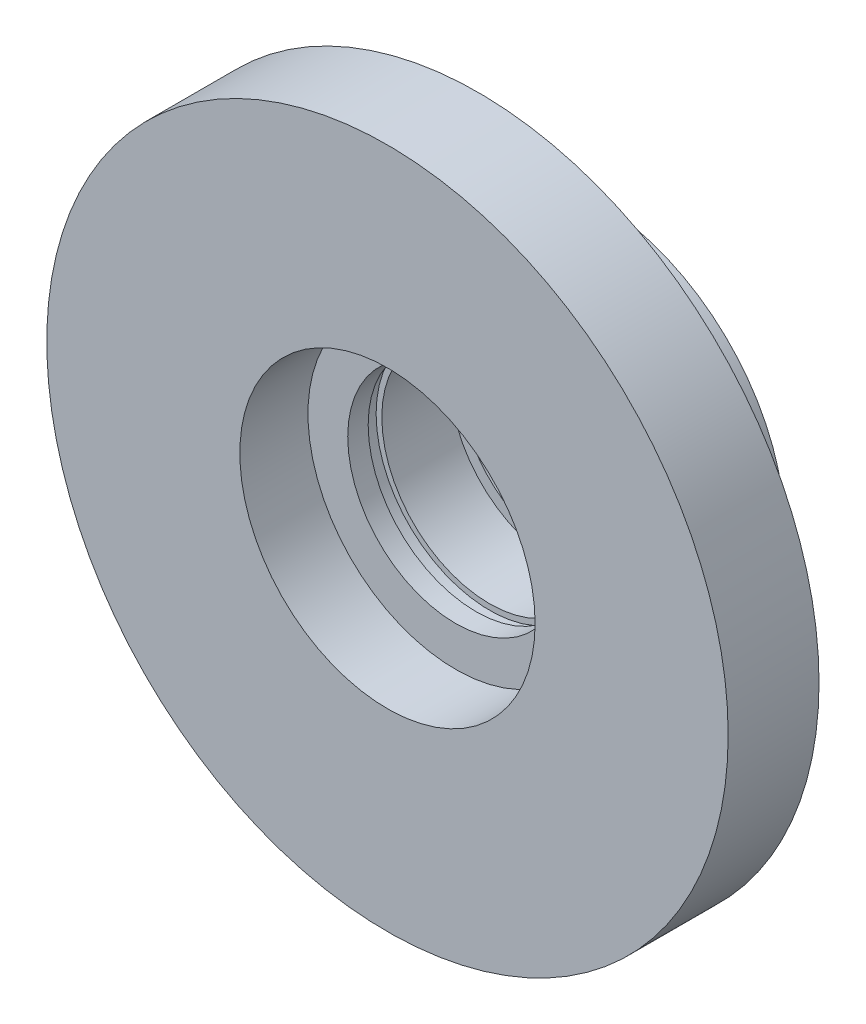
ISO-10303-21;
HEADER;
FILE_DESCRIPTION(('STEP AP214'),'2;1');
FILE_NAME('part.step','',(''),(''),'','','');
FILE_SCHEMA(('AUTOMOTIVE_DESIGN { 1 0 10303 214 1 1 1 1 }'));
ENDSEC;
DATA;
#1=APPLICATION_CONTEXT('core data for automotive mechanical design processes');
#2=APPLICATION_PROTOCOL_DEFINITION('international standard','automotive_design',2000,#1);
#3=PRODUCT_CONTEXT('',#1,'mechanical');
#4=PRODUCT('Part','Part','',(#3));
#5=PRODUCT_RELATED_PRODUCT_CATEGORY('part','',(#4));
#6=PRODUCT_DEFINITION_FORMATION('','',#4);
#7=PRODUCT_DEFINITION_CONTEXT('part definition',#1,'design');
#8=PRODUCT_DEFINITION('design','',#6,#7);
#9=PRODUCT_DEFINITION_SHAPE('','',#8);
#10=(LENGTH_UNIT() NAMED_UNIT(*) SI_UNIT(.MILLI.,.METRE.));
#11=(NAMED_UNIT(*) PLANE_ANGLE_UNIT() SI_UNIT($,.RADIAN.));
#12=(NAMED_UNIT(*) SI_UNIT($,.STERADIAN.) SOLID_ANGLE_UNIT());
#13=UNCERTAINTY_MEASURE_WITH_UNIT(LENGTH_MEASURE(1.E-05),#10,'distance_accuracy_value','');
#14=(GEOMETRIC_REPRESENTATION_CONTEXT(3) GLOBAL_UNCERTAINTY_ASSIGNED_CONTEXT((#13)) GLOBAL_UNIT_ASSIGNED_CONTEXT((#10,
#11,#12)) REPRESENTATION_CONTEXT('',''));
#15=CARTESIAN_POINT('',(0.,0.,0.));
#16=DIRECTION('',(0.,0.,1.));
#17=DIRECTION('',(1.,0.,0.));
#18=AXIS2_PLACEMENT_3D('',#15,#16,#17);
#19=CARTESIAN_POINT('',(0.,0.,12.));
#20=DIRECTION('',(0.,0.,-1.));
#21=DIRECTION('',(-1.,0.,0.));
#22=AXIS2_PLACEMENT_3D('',#19,#20,#21);
#23=CYLINDRICAL_SURFACE('',#22,9.5);
#24=CARTESIAN_POINT('',(0.,0.,3.));
#25=DIRECTION('',(0.,0.,1.));
#26=DIRECTION('',(1.,0.,0.));
#27=AXIS2_PLACEMENT_3D('',#24,#25,#26);
#28=CIRCLE('',#27,9.5);
#29=CARTESIAN_POINT('',(9.5,0.,3.));
#30=VERTEX_POINT('',#29);
#31=EDGE_CURVE('E53',#30,#30,#28,.T.);
#32=ORIENTED_EDGE('',*,*,#31,.F.);
#33=EDGE_LOOP('',(#32));
#34=FACE_BOUND('',#33,.T.);
#35=CARTESIAN_POINT('',(0.,0.,9.));
#36=DIRECTION('',(0.,0.,1.));
#37=DIRECTION('',(1.,0.,0.));
#38=AXIS2_PLACEMENT_3D('',#35,#36,#37);
#39=CIRCLE('',#38,9.5);
#40=CARTESIAN_POINT('',(9.5,0.,9.));
#41=VERTEX_POINT('',#40);
#42=EDGE_CURVE('E35',#41,#41,#39,.T.);
#43=ORIENTED_EDGE('',*,*,#42,.T.);
#44=EDGE_LOOP('',(#43));
#45=FACE_BOUND('',#44,.T.);
#46=ADVANCED_FACE('F31',(#34,#45),#23,.F.);
#47=CARTESIAN_POINT('',(0.,0.,3.));
#48=DIRECTION('',(0.,0.,-1.));
#49=DIRECTION('',(-1.,0.,0.));
#50=AXIS2_PLACEMENT_3D('',#47,#48,#49);
#51=PLANE('',#50);
#52=CARTESIAN_POINT('',(0.,0.,3.));
#53=DIRECTION('',(0.,0.,-1.));
#54=DIRECTION('',(-1.,0.,0.));
#55=AXIS2_PLACEMENT_3D('',#52,#53,#54);
#56=CIRCLE('',#55,8.5);
#57=CARTESIAN_POINT('',(-8.5,0.,3.));
#58=VERTEX_POINT('',#57);
#59=EDGE_CURVE('E68',#58,#58,#56,.T.);
#60=ORIENTED_EDGE('',*,*,#59,.T.);
#61=EDGE_LOOP('',(#60));
#62=FACE_BOUND('',#61,.T.);
#63=ORIENTED_EDGE('',*,*,#31,.T.);
#64=EDGE_LOOP('',(#63));
#65=FACE_BOUND('',#64,.T.);
#66=ADVANCED_FACE('F100',(#62,#65),#51,.F.);
#67=CARTESIAN_POINT('',(0.,0.,10.));
#68=DIRECTION('',(0.,0.,-1.));
#69=DIRECTION('',(-1.,0.,0.));
#70=AXIS2_PLACEMENT_3D('',#67,#68,#69);
#71=CYLINDRICAL_SURFACE('',#70,13.);
#72=CARTESIAN_POINT('',(0.,0.,12.));
#73=DIRECTION('',(0.,0.,1.));
#74=DIRECTION('',(1.,0.,0.));
#75=AXIS2_PLACEMENT_3D('',#72,#73,#74);
#76=CIRCLE('',#75,13.);
#77=CARTESIAN_POINT('',(13.,0.,12.));
#78=VERTEX_POINT('',#77);
#79=EDGE_CURVE('E10',#78,#78,#76,.T.);
#80=ORIENTED_EDGE('',*,*,#79,.F.);
#81=EDGE_LOOP('',(#80));
#82=FACE_BOUND('',#81,.T.);
#83=CARTESIAN_POINT('',(0.,0.,18.));
#84=DIRECTION('',(0.,0.,1.));
#85=DIRECTION('',(1.,0.,0.));
#86=AXIS2_PLACEMENT_3D('',#83,#84,#85);
#87=CIRCLE('',#86,13.);
#88=CARTESIAN_POINT('',(13.,0.,18.));
#89=VERTEX_POINT('',#88);
#90=EDGE_CURVE('E71',#89,#89,#87,.T.);
#91=ORIENTED_EDGE('',*,*,#90,.T.);
#92=EDGE_LOOP('',(#91));
#93=FACE_BOUND('',#92,.T.);
#94=ADVANCED_FACE('F107',(#82,#93),#71,.F.);
#95=CARTESIAN_POINT('',(0.,0.,0.));
#96=DIRECTION('',(0.,0.,1.));
#97=DIRECTION('',(1.,0.,0.));
#98=AXIS2_PLACEMENT_3D('',#95,#96,#97);
#99=PLANE('',#98);
#100=CARTESIAN_POINT('',(0.,0.,0.));
#101=DIRECTION('',(0.,0.,1.));
#102=DIRECTION('',(1.,0.,0.));
#103=AXIS2_PLACEMENT_3D('',#100,#101,#102);
#104=CIRCLE('',#103,17.);
#105=CARTESIAN_POINT('',(17.,0.,0.));
#106=VERTEX_POINT('',#105);
#107=EDGE_CURVE('E44',#106,#106,#104,.T.);
#108=ORIENTED_EDGE('',*,*,#107,.F.);
#109=EDGE_LOOP('',(#108));
#110=FACE_BOUND('',#109,.T.);
#111=CARTESIAN_POINT('',(0.,0.,0.));
#112=DIRECTION('',(0.,0.,-1.));
#113=DIRECTION('',(-1.,0.,0.));
#114=AXIS2_PLACEMENT_3D('',#111,#112,#113);
#115=CIRCLE('',#114,8.5);
#116=CARTESIAN_POINT('',(-8.5,0.,0.));
#117=VERTEX_POINT('',#116);
#118=EDGE_CURVE('E65',#117,#117,#115,.T.);
#119=ORIENTED_EDGE('',*,*,#118,.F.);
#120=EDGE_LOOP('',(#119));
#121=FACE_BOUND('',#120,.T.);
#122=ADVANCED_FACE('F138',(#110,#121),#99,.F.);
#123=CARTESIAN_POINT('',(0.,0.,10.));
#124=DIRECTION('',(0.,0.,-1.));
#125=DIRECTION('',(-1.,0.,0.));
#126=AXIS2_PLACEMENT_3D('',#123,#124,#125);
#127=CYLINDRICAL_SURFACE('',#126,17.);
#128=ORIENTED_EDGE('',*,*,#107,.T.);
#129=EDGE_LOOP('',(#128));
#130=FACE_BOUND('',#129,.T.);
#131=CARTESIAN_POINT('',(0.,0.,10.));
#132=DIRECTION('',(0.,0.,1.));
#133=DIRECTION('',(1.,0.,0.));
#134=AXIS2_PLACEMENT_3D('',#131,#132,#133);
#135=CIRCLE('',#134,17.);
#136=CARTESIAN_POINT('',(17.,0.,10.));
#137=VERTEX_POINT('',#136);
#138=EDGE_CURVE('E39',#137,#137,#135,.T.);
#139=ORIENTED_EDGE('',*,*,#138,.F.);
#140=EDGE_LOOP('',(#139));
#141=FACE_BOUND('',#140,.T.);
#142=ADVANCED_FACE('F33',(#130,#141),#127,.T.);
#143=CARTESIAN_POINT('',(0.,0.,18.));
#144=DIRECTION('',(0.,0.,1.));
#145=DIRECTION('',(1.,0.,0.));
#146=AXIS2_PLACEMENT_3D('',#143,#144,#145);
#147=PLANE('',#146);
#148=CARTESIAN_POINT('',(0.,0.,18.));
#149=DIRECTION('',(0.,0.,1.));
#150=DIRECTION('',(1.,0.,0.));
#151=AXIS2_PLACEMENT_3D('',#148,#149,#150);
#152=CIRCLE('',#151,30.);
#153=CARTESIAN_POINT('',(30.,0.,18.));
#154=VERTEX_POINT('',#153);
#155=EDGE_CURVE('E77',#154,#154,#152,.T.);
#156=ORIENTED_EDGE('',*,*,#155,.T.);
#157=EDGE_LOOP('',(#156));
#158=FACE_BOUND('',#157,.T.);
#159=ORIENTED_EDGE('',*,*,#90,.F.);
#160=EDGE_LOOP('',(#159));
#161=FACE_BOUND('',#160,.T.);
#162=ADVANCED_FACE('F87',(#158,#161),#147,.T.);
#163=CARTESIAN_POINT('',(0.,0.,10.));
#164=DIRECTION('',(0.,0.,1.));
#165=DIRECTION('',(1.,0.,0.));
#166=AXIS2_PLACEMENT_3D('',#163,#164,#165);
#167=PLANE('',#166);
#168=ORIENTED_EDGE('',*,*,#138,.T.);
#169=EDGE_LOOP('',(#168));
#170=FACE_BOUND('',#169,.T.);
#171=CARTESIAN_POINT('',(0.,0.,10.));
#172=DIRECTION('',(0.,0.,1.));
#173=DIRECTION('',(1.,0.,0.));
#174=AXIS2_PLACEMENT_3D('',#171,#172,#173);
#175=CIRCLE('',#174,30.);
#176=CARTESIAN_POINT('',(30.,0.,10.));
#177=VERTEX_POINT('',#176);
#178=EDGE_CURVE('E76',#177,#177,#175,.T.);
#179=ORIENTED_EDGE('',*,*,#178,.F.);
#180=EDGE_LOOP('',(#179));
#181=FACE_BOUND('',#180,.T.);
#182=ADVANCED_FACE('F85',(#170,#181),#167,.F.);
#183=CARTESIAN_POINT('',(0.,0.,18.));
#184=DIRECTION('',(0.,0.,-1.));
#185=DIRECTION('',(-1.,0.,0.));
#186=AXIS2_PLACEMENT_3D('',#183,#184,#185);
#187=CYLINDRICAL_SURFACE('',#186,30.);
#188=ORIENTED_EDGE('',*,*,#155,.F.);
#189=EDGE_LOOP('',(#188));
#190=FACE_BOUND('',#189,.T.);
#191=ORIENTED_EDGE('',*,*,#178,.T.);
#192=EDGE_LOOP('',(#191));
#193=FACE_BOUND('',#192,.T.);
#194=ADVANCED_FACE('F83',(#190,#193),#187,.T.);
#195=CARTESIAN_POINT('',(0.,0.,3.));
#196=DIRECTION('',(0.,0.,-1.));
#197=DIRECTION('',(-1.,0.,0.));
#198=AXIS2_PLACEMENT_3D('',#195,#196,#197);
#199=CYLINDRICAL_SURFACE('',#198,8.5);
#200=ORIENTED_EDGE('',*,*,#59,.F.);
#201=EDGE_LOOP('',(#200));
#202=FACE_BOUND('',#201,.T.);
#203=ORIENTED_EDGE('',*,*,#118,.T.);
#204=EDGE_LOOP('',(#203));
#205=FACE_BOUND('',#204,.T.);
#206=ADVANCED_FACE('F94',(#202,#205),#199,.F.);
#207=CARTESIAN_POINT('',(0.,0.,12.));
#208=DIRECTION('',(0.,0.,1.));
#209=DIRECTION('',(1.,0.,0.));
#210=AXIS2_PLACEMENT_3D('',#207,#208,#209);
#211=PLANE('',#210);
#212=ORIENTED_EDGE('',*,*,#79,.T.);
#213=EDGE_LOOP('',(#212));
#214=FACE_BOUND('',#213,.T.);
#215=CARTESIAN_POINT('',(0.,0.,12.));
#216=DIRECTION('',(0.,0.,1.));
#217=DIRECTION('',(1.,0.,0.));
#218=AXIS2_PLACEMENT_3D('',#215,#216,#217);
#219=CIRCLE('',#218,9.5);
#220=CARTESIAN_POINT('',(9.5,0.,12.));
#221=VERTEX_POINT('',#220);
#222=EDGE_CURVE('E62',#221,#221,#219,.T.);
#223=ORIENTED_EDGE('',*,*,#222,.F.);
#224=EDGE_LOOP('',(#223));
#225=FACE_BOUND('',#224,.T.);
#226=ADVANCED_FACE('F116',(#214,#225),#211,.T.);
#227=CARTESIAN_POINT('',(0.,0.,10.2));
#228=DIRECTION('',(0.,0.,1.));
#229=DIRECTION('',(1.,0.,0.));
#230=AXIS2_PLACEMENT_3D('',#227,#228,#229);
#231=CIRCLE('',#230,9.5);
#232=CARTESIAN_POINT('',(9.5,0.,10.2));
#233=VERTEX_POINT('',#232);
#234=EDGE_CURVE('E47',#233,#233,#231,.T.);
#235=ORIENTED_EDGE('',*,*,#234,.F.);
#236=EDGE_LOOP('',(#235));
#237=FACE_BOUND('',#236,.T.);
#238=ORIENTED_EDGE('',*,*,#222,.T.);
#239=EDGE_LOOP('',(#238));
#240=FACE_BOUND('',#239,.T.);
#241=ADVANCED_FACE('F103',(#237,#240),#23,.F.);
#242=CARTESIAN_POINT('',(0.,0.,9.));
#243=DIRECTION('',(0.,0.,1.));
#244=DIRECTION('',(1.,0.,0.));
#245=AXIS2_PLACEMENT_3D('',#242,#243,#244);
#246=CYLINDRICAL_SURFACE('',#245,10.);
#247=CARTESIAN_POINT('',(0.,0.,9.));
#248=DIRECTION('',(0.,0.,1.));
#249=DIRECTION('',(1.,0.,0.));
#250=AXIS2_PLACEMENT_3D('',#247,#248,#249);
#251=CIRCLE('',#250,10.);
#252=CARTESIAN_POINT('',(10.,0.,9.));
#253=VERTEX_POINT('',#252);
#254=EDGE_CURVE('E49',#253,#253,#251,.T.);
#255=ORIENTED_EDGE('',*,*,#254,.F.);
#256=EDGE_LOOP('',(#255));
#257=FACE_BOUND('',#256,.T.);
#258=CARTESIAN_POINT('',(0.,0.,10.2));
#259=DIRECTION('',(0.,0.,1.));
#260=DIRECTION('',(1.,0.,0.));
#261=AXIS2_PLACEMENT_3D('',#258,#259,#260);
#262=CIRCLE('',#261,10.);
#263=CARTESIAN_POINT('',(10.,0.,10.2));
#264=VERTEX_POINT('',#263);
#265=EDGE_CURVE('E55',#264,#264,#262,.T.);
#266=ORIENTED_EDGE('',*,*,#265,.T.);
#267=EDGE_LOOP('',(#266));
#268=FACE_BOUND('',#267,.T.);
#269=ADVANCED_FACE('F115',(#257,#268),#246,.F.);
#270=CARTESIAN_POINT('',(0.,0.,9.));
#271=DIRECTION('',(0.,0.,1.));
#272=DIRECTION('',(1.,0.,0.));
#273=AXIS2_PLACEMENT_3D('',#270,#271,#272);
#274=PLANE('',#273);
#275=ORIENTED_EDGE('',*,*,#42,.F.);
#276=EDGE_LOOP('',(#275));
#277=FACE_BOUND('',#276,.T.);
#278=ORIENTED_EDGE('',*,*,#254,.T.);
#279=EDGE_LOOP('',(#278));
#280=FACE_BOUND('',#279,.T.);
#281=ADVANCED_FACE('F122',(#277,#280),#274,.T.);
#282=CARTESIAN_POINT('',(0.,0.,10.2));
#283=DIRECTION('',(0.,0.,1.));
#284=DIRECTION('',(1.,0.,0.));
#285=AXIS2_PLACEMENT_3D('',#282,#283,#284);
#286=PLANE('',#285);
#287=ORIENTED_EDGE('',*,*,#234,.T.);
#288=EDGE_LOOP('',(#287));
#289=FACE_BOUND('',#288,.T.);
#290=ORIENTED_EDGE('',*,*,#265,.F.);
#291=EDGE_LOOP('',(#290));
#292=FACE_BOUND('',#291,.T.);
#293=ADVANCED_FACE('F226',(#289,#292),#286,.F.);
#294=CLOSED_SHELL('',(#46,#66,#94,#122,#142,#162,#182,#194,#206,#226,#241,#269,#281,#293));
#295=MANIFOLD_SOLID_BREP('B2',#294);
#296=ADVANCED_BREP_SHAPE_REPRESENTATION('',(#18,#295),#14);
#297=SHAPE_DEFINITION_REPRESENTATION(#9,#296);
ENDSEC;
END-ISO-10303-21;
